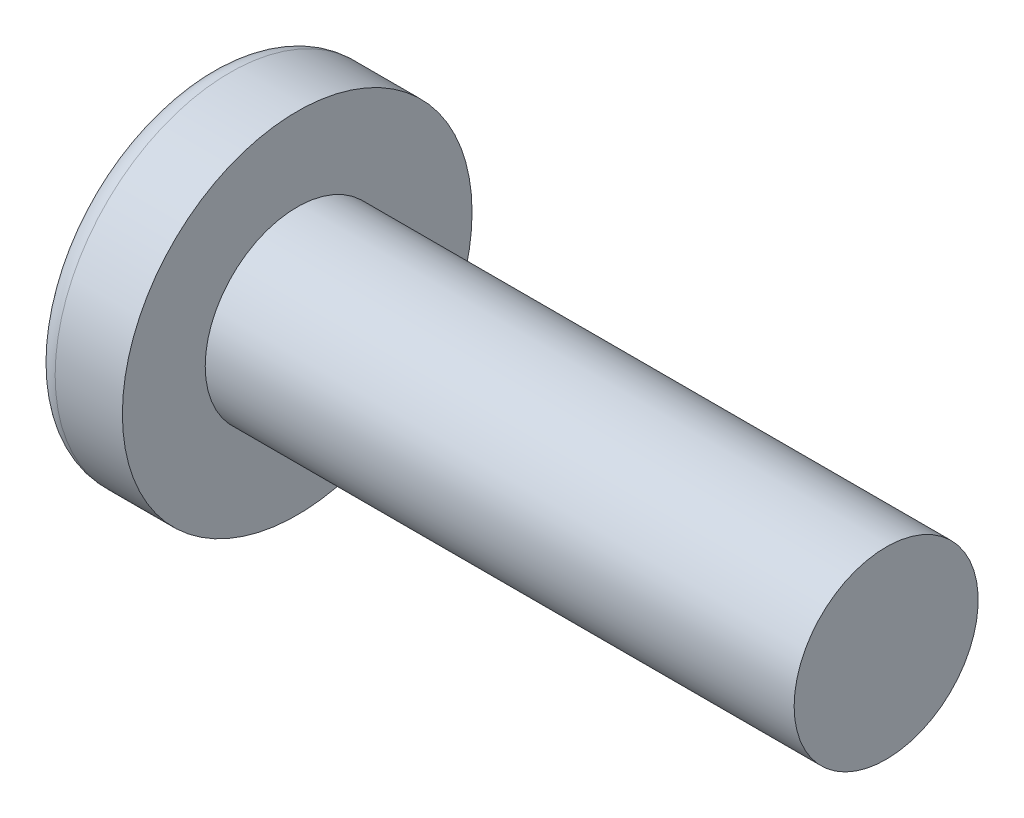
ISO-10303-21;
HEADER;
FILE_DESCRIPTION(('STEP AP214'),'2;1');
FILE_NAME('part.step','',(''),(''),'','','');
FILE_SCHEMA(('AUTOMOTIVE_DESIGN { 1 0 10303 214 1 1 1 1 }'));
ENDSEC;
DATA;
#1=APPLICATION_CONTEXT('core data for automotive mechanical design processes');
#2=APPLICATION_PROTOCOL_DEFINITION('international standard','automotive_design',2000,#1);
#3=PRODUCT_CONTEXT('',#1,'mechanical');
#4=PRODUCT('Part','Part','',(#3));
#5=PRODUCT_RELATED_PRODUCT_CATEGORY('part','',(#4));
#6=PRODUCT_DEFINITION_FORMATION('','',#4);
#7=PRODUCT_DEFINITION_CONTEXT('part definition',#1,'design');
#8=PRODUCT_DEFINITION('design','',#6,#7);
#9=PRODUCT_DEFINITION_SHAPE('','',#8);
#10=(LENGTH_UNIT() NAMED_UNIT(*) SI_UNIT(.MILLI.,.METRE.));
#11=(NAMED_UNIT(*) PLANE_ANGLE_UNIT() SI_UNIT($,.RADIAN.));
#12=(NAMED_UNIT(*) SI_UNIT($,.STERADIAN.) SOLID_ANGLE_UNIT());
#13=UNCERTAINTY_MEASURE_WITH_UNIT(LENGTH_MEASURE(1.E-05),#10,'distance_accuracy_value','');
#14=(GEOMETRIC_REPRESENTATION_CONTEXT(3) GLOBAL_UNCERTAINTY_ASSIGNED_CONTEXT((#13)) GLOBAL_UNIT_ASSIGNED_CONTEXT((#10,
#11,#12)) REPRESENTATION_CONTEXT('',''));
#15=CARTESIAN_POINT('',(0.,0.,0.));
#16=DIRECTION('',(0.,0.,1.));
#17=DIRECTION('',(1.,0.,0.));
#18=AXIS2_PLACEMENT_3D('',#15,#16,#17);
#19=CARTESIAN_POINT('',(-12.2791848078941,5.36412812236495,7.05673995589386));
#20=DIRECTION('',(-1.,0.,0.));
#21=DIRECTION('',(0.,1.,0.));
#22=AXIS2_PLACEMENT_3D('',#19,#20,#21);
#23=SPHERICAL_SURFACE('',#22,8.);
#24=CARTESIAN_POINT('',(-18.902736650114,5.36412812236495,7.05673995589386));
#25=DIRECTION('',(-1.,0.,0.));
#26=DIRECTION('',(0.,0.,1.));
#27=AXIS2_PLACEMENT_3D('',#24,#25,#26);
#28=CIRCLE('',#27,4.48648648648649);
#29=CARTESIAN_POINT('',(-18.902736650114,5.36412812236495,11.5432264423804));
#30=VERTEX_POINT('',#29);
#31=EDGE_CURVE('E161',#30,#30,#28,.T.);
#32=ORIENTED_EDGE('',*,*,#31,.T.);
#33=EDGE_LOOP('',(#32));
#34=FACE_BOUND('',#33,.T.);
#35=CARTESIAN_POINT('',(-12.2941591376146,5.18743103166329,7.05673995589386));
#36=DIRECTION('',(-0.0844430766861806,-0.996428304896931,0.));
#37=DIRECTION('',(0.996428304896931,-0.0844430766861806,0.));
#38=AXIS2_PLACEMENT_3D('',#35,#36,#37);
#39=CIRCLE('',#38,7.99803437774476);
#40=CARTESIAN_POINT('',(-19.9540534851163,5.83657462043462,9.26426913890705));
#41=VERTEX_POINT('',#40);
#42=CARTESIAN_POINT('',(-20.2482021568977,5.86150247397542,7.55411430750434));
#43=VERTEX_POINT('',#42);
#44=EDGE_CURVE('E192',#41,#43,#39,.T.);
#45=ORIENTED_EDGE('',*,*,#44,.F.);
#46=CARTESIAN_POINT('',(-13.9642134215179,5.36412812236496,4.7972697694438));
#47=DIRECTION('',(0.597823879730417,0.,0.801627475093059));
#48=DIRECTION('',(0.801627475093059,0.,-0.597823879730417));
#49=AXIS2_PLACEMENT_3D('',#46,#47,#48);
#50=CIRCLE('',#49,7.48702030502205);
#51=CARTESIAN_POINT('',(-19.9540534851163,4.89168162429526,9.26426913890705));
#52=VERTEX_POINT('',#51);
#53=EDGE_CURVE('E157',#41,#52,#50,.T.);
#54=ORIENTED_EDGE('',*,*,#53,.T.);
#55=CARTESIAN_POINT('',(-12.2941591376146,5.5408252130666,7.05673995589386));
#56=DIRECTION('',(-0.0844430766861806,0.996428304896931,0.));
#57=DIRECTION('',(-0.996428304896931,-0.0844430766861806,0.));
#58=AXIS2_PLACEMENT_3D('',#55,#56,#57);
#59=CIRCLE('',#58,7.99803437774476);
#60=CARTESIAN_POINT('',(-20.2482021568977,4.86675377075447,7.55411430750434));
#61=VERTEX_POINT('',#60);
#62=EDGE_CURVE('E113',#61,#52,#59,.T.);
#63=ORIENTED_EDGE('',*,*,#62,.F.);
#64=CARTESIAN_POINT('',(-12.2941591376146,5.36412812236495,6.88004286519221));
#65=DIRECTION('',(-0.0844430766861806,0.,-0.996428304896931));
#66=DIRECTION('',(-0.996428304896931,0.,0.0844430766861806));
#67=AXIS2_PLACEMENT_3D('',#64,#65,#66);
#68=CIRCLE('',#67,7.99803437774476);
#69=CARTESIAN_POINT('',(-19.9540534851163,3.15659893935176,7.52918645396354));
#70=VERTEX_POINT('',#69);
#71=EDGE_CURVE('E138',#70,#61,#68,.T.);
#72=ORIENTED_EDGE('',*,*,#71,.F.);
#73=CARTESIAN_POINT('',(-13.9642134215179,7.62359830881501,7.05673995589386));
#74=DIRECTION('',(0.597823879730417,-0.801627475093059,0.));
#75=DIRECTION('',(0.801627475093059,0.597823879730417,0.));
#76=AXIS2_PLACEMENT_3D('',#73,#74,#75);
#77=CIRCLE('',#76,7.48702030502205);
#78=CARTESIAN_POINT('',(-19.9540534851163,3.15659893935176,6.58429345782418));
#79=VERTEX_POINT('',#78);
#80=EDGE_CURVE('E146',#70,#79,#77,.T.);
#81=ORIENTED_EDGE('',*,*,#80,.T.);
#82=CARTESIAN_POINT('',(-12.2941591376146,5.36412812236495,7.23343704659552));
#83=DIRECTION('',(-0.0844430766861806,0.,0.996428304896931));
#84=DIRECTION('',(0.996428304896931,0.,0.0844430766861806));
#85=AXIS2_PLACEMENT_3D('',#82,#83,#84);
#86=CIRCLE('',#85,7.99803437774476);
#87=CARTESIAN_POINT('',(-20.2482021568977,4.86675377075448,6.55936560428339));
#88=VERTEX_POINT('',#87);
#89=EDGE_CURVE('E56',#88,#79,#86,.T.);
#90=ORIENTED_EDGE('',*,*,#89,.F.);
#91=CARTESIAN_POINT('',(-19.9540534851163,4.89168162429528,4.84921077288068));
#92=VERTEX_POINT('',#91);
#93=EDGE_CURVE('E199',#92,#88,#59,.T.);
#94=ORIENTED_EDGE('',*,*,#93,.F.);
#95=CARTESIAN_POINT('',(-13.9642134215179,5.36412812236494,9.31621014234393));
#96=DIRECTION('',(0.597823879730417,0.,-0.801627475093059));
#97=DIRECTION('',(-0.801627475093059,0.,-0.597823879730417));
#98=AXIS2_PLACEMENT_3D('',#95,#96,#97);
#99=CIRCLE('',#98,7.48702030502205);
#100=CARTESIAN_POINT('',(-19.9540534851163,5.83657462043463,4.84921077288068));
#101=VERTEX_POINT('',#100);
#102=EDGE_CURVE('E139',#92,#101,#99,.T.);
#103=ORIENTED_EDGE('',*,*,#102,.T.);
#104=CARTESIAN_POINT('',(-20.2482021568977,5.86150247397542,6.55936560428339));
#105=VERTEX_POINT('',#104);
#106=EDGE_CURVE('E187',#105,#101,#39,.T.);
#107=ORIENTED_EDGE('',*,*,#106,.F.);
#108=CARTESIAN_POINT('',(-19.9540534851163,7.57165730537813,6.58429345782418));
#109=VERTEX_POINT('',#108);
#110=EDGE_CURVE('E49',#109,#105,#86,.T.);
#111=ORIENTED_EDGE('',*,*,#110,.F.);
#112=CARTESIAN_POINT('',(-13.9642134215179,3.10465793591488,7.05673995589386));
#113=DIRECTION('',(0.597823879730417,0.801627475093059,0.));
#114=DIRECTION('',(-0.801627475093059,0.597823879730417,0.));
#115=AXIS2_PLACEMENT_3D('',#112,#113,#114);
#116=CIRCLE('',#115,7.48702030502205);
#117=CARTESIAN_POINT('',(-19.9540534851163,7.57165730537813,7.52918645396354));
#118=VERTEX_POINT('',#117);
#119=EDGE_CURVE('E11',#109,#118,#116,.T.);
#120=ORIENTED_EDGE('',*,*,#119,.T.);
#121=EDGE_CURVE('E175',#43,#118,#68,.T.);
#122=ORIENTED_EDGE('',*,*,#121,.F.);
#123=EDGE_LOOP('',(#45,#54,#63,#72,#81,#90,#94,#103,#107,#111,#120,#122));
#124=FACE_BOUND('',#123,.T.);
#125=ADVANCED_FACE('F41',(#34,#124),#23,.T.);
#126=CARTESIAN_POINT('',(-16.9939575351668,5.36412812236495,6.83514904680295));
#127=DIRECTION('',(-0.0844430766861806,0.,0.996428304896931));
#128=DIRECTION('',(0.996428304896931,0.,0.0844430766861806));
#129=AXIS2_PLACEMENT_3D('',#126,#127,#128);
#130=PLANE('',#129);
#131=ORIENTED_EDGE('',*,*,#110,.T.);
#132=DIRECTION('',(0.992894609445471,-0.0841436109699554,0.0841436109699551));
#133=VECTOR('',#132,1.);
#134=CARTESIAN_POINT('',(-16.9754445591879,5.58415013518645,6.83671794307236));
#135=LINE('',#134,#133);
#136=CARTESIAN_POINT('',(-17.3291848078941,5.61412812236495,6.80673995589386));
#137=VERTEX_POINT('',#136);
#138=EDGE_CURVE('E181',#105,#137,#135,.T.);
#139=ORIENTED_EDGE('',*,*,#138,.T.);
#140=DIRECTION('',(0.799784057588365,-0.596449127693018,0.0677783099651157));
#141=VECTOR('',#140,1.);
#142=CARTESIAN_POINT('',(-20.2791848078941,7.81412812236495,6.55673995589386));
#143=LINE('',#142,#141);
#144=EDGE_CURVE('E162',#109,#137,#143,.T.);
#145=ORIENTED_EDGE('',*,*,#144,.F.);
#146=EDGE_LOOP('',(#131,#139,#145));
#147=FACE_BOUND('',#146,.T.);
#148=ADVANCED_FACE('F180',(#147),#130,.T.);
#149=DIRECTION('',(0.799784057588365,0.596449127693018,0.0677783099651157));
#150=VECTOR('',#149,1.);
#151=CARTESIAN_POINT('',(-20.2791848078941,2.91412812236495,6.55673995589386));
#152=LINE('',#151,#150);
#153=CARTESIAN_POINT('',(-17.3291848078941,5.11412812236495,6.80673995589386));
#154=VERTEX_POINT('',#153);
#155=EDGE_CURVE('E147',#79,#154,#152,.T.);
#156=ORIENTED_EDGE('',*,*,#155,.T.);
#157=DIRECTION('',(-0.992894609445471,-0.0841436109699548,-0.0841436109699552));
#158=VECTOR('',#157,1.);
#159=CARTESIAN_POINT('',(-16.9754445591879,5.14410610954344,6.83671794307236));
#160=LINE('',#159,#158);
#161=EDGE_CURVE('E202',#154,#88,#160,.T.);
#162=ORIENTED_EDGE('',*,*,#161,.T.);
#163=ORIENTED_EDGE('',*,*,#89,.T.);
#164=EDGE_LOOP('',(#156,#162,#163));
#165=FACE_BOUND('',#164,.T.);
#166=ADVANCED_FACE('F217',(#165),#130,.T.);
#167=CARTESIAN_POINT('',(-16.9939575351668,5.36412812236495,7.27833086498477));
#168=DIRECTION('',(-0.0844430766861806,0.,-0.996428304896931));
#169=DIRECTION('',(-0.996428304896931,0.,0.0844430766861806));
#170=AXIS2_PLACEMENT_3D('',#167,#168,#169);
#171=PLANE('',#170);
#172=DIRECTION('',(0.799784057588365,-0.596449127693018,-0.0677783099651158));
#173=VECTOR('',#172,1.);
#174=CARTESIAN_POINT('',(-20.2791848078941,7.81412812236495,7.55673995589386));
#175=LINE('',#174,#173);
#176=CARTESIAN_POINT('',(-17.3291848078941,5.61412812236495,7.30673995589386));
#177=VERTEX_POINT('',#176);
#178=EDGE_CURVE('E218',#118,#177,#175,.T.);
#179=ORIENTED_EDGE('',*,*,#178,.T.);
#180=DIRECTION('',(-0.992894609445471,0.0841436109699549,0.0841436109699551));
#181=VECTOR('',#180,1.);
#182=CARTESIAN_POINT('',(-16.9754445591879,5.58415013518645,7.27676196871537));
#183=LINE('',#182,#181);
#184=EDGE_CURVE('E196',#177,#43,#183,.T.);
#185=ORIENTED_EDGE('',*,*,#184,.T.);
#186=ORIENTED_EDGE('',*,*,#121,.T.);
#187=EDGE_LOOP('',(#179,#185,#186));
#188=FACE_BOUND('',#187,.T.);
#189=ADVANCED_FACE('F222',(#188),#171,.T.);
#190=ORIENTED_EDGE('',*,*,#71,.T.);
#191=DIRECTION('',(0.992894609445471,0.0841436109699554,-0.0841436109699551));
#192=VECTOR('',#191,1.);
#193=CARTESIAN_POINT('',(-16.9754445591879,5.14410610954344,7.27676196871537));
#194=LINE('',#193,#192);
#195=CARTESIAN_POINT('',(-17.3291848078941,5.11412812236495,7.30673995589386));
#196=VERTEX_POINT('',#195);
#197=EDGE_CURVE('E111',#61,#196,#194,.T.);
#198=ORIENTED_EDGE('',*,*,#197,.T.);
#199=DIRECTION('',(0.799784057588366,0.596449127693018,-0.0677783099651156));
#200=VECTOR('',#199,1.);
#201=CARTESIAN_POINT('',(-20.2791848078941,2.91412812236495,7.55673995589386));
#202=LINE('',#201,#200);
#203=EDGE_CURVE('E136',#70,#196,#202,.T.);
#204=ORIENTED_EDGE('',*,*,#203,.F.);
#205=EDGE_LOOP('',(#190,#198,#204));
#206=FACE_BOUND('',#205,.T.);
#207=ADVANCED_FACE('F135',(#206),#171,.T.);
#208=CARTESIAN_POINT('',(-45.6791848078941,5.36412812236495,7.05673995589386));
#209=DIRECTION('',(-1.,0.,0.));
#210=DIRECTION('',(0.,0.,1.));
#211=AXIS2_PLACEMENT_3D('',#208,#209,#210);
#212=CYLINDRICAL_SURFACE('',#211,2.5);
#213=CARTESIAN_POINT('',(-0.579184807894116,5.36412812236495,7.05673995589386));
#214=DIRECTION('',(-1.,0.,0.));
#215=DIRECTION('',(0.,0.,1.));
#216=AXIS2_PLACEMENT_3D('',#213,#214,#215);
#217=CIRCLE('',#216,2.5);
#218=CARTESIAN_POINT('',(-0.579184807894116,5.36412812236495,9.55673995589386));
#219=VERTEX_POINT('',#218);
#220=EDGE_CURVE('E158',#219,#219,#217,.T.);
#221=ORIENTED_EDGE('',*,*,#220,.T.);
#222=EDGE_LOOP('',(#221));
#223=FACE_BOUND('',#222,.T.);
#224=CARTESIAN_POINT('',(-16.5791848078941,5.36412812236495,7.05673995589386));
#225=DIRECTION('',(-1.,0.,0.));
#226=DIRECTION('',(0.,0.,1.));
#227=AXIS2_PLACEMENT_3D('',#224,#225,#226);
#228=CIRCLE('',#227,2.5);
#229=CARTESIAN_POINT('',(-16.5791848078941,5.36412812236495,9.55673995589386));
#230=VERTEX_POINT('',#229);
#231=EDGE_CURVE('E171',#230,#230,#228,.T.);
#232=ORIENTED_EDGE('',*,*,#231,.F.);
#233=EDGE_LOOP('',(#232));
#234=FACE_BOUND('',#233,.T.);
#235=ADVANCED_FACE('F43',(#223,#234),#212,.T.);
#236=CARTESIAN_POINT('',(-16.5791848078941,7.86412812236495,7.05673995589386));
#237=DIRECTION('',(-1.,0.,0.));
#238=DIRECTION('',(0.,0.,1.));
#239=AXIS2_PLACEMENT_3D('',#236,#237,#238);
#240=PLANE('',#239);
#241=CARTESIAN_POINT('',(-16.5791848078941,5.36412812236495,7.05673995589386));
#242=DIRECTION('',(-1.,0.,0.));
#243=DIRECTION('',(0.,0.,1.));
#244=AXIS2_PLACEMENT_3D('',#241,#242,#243);
#245=CIRCLE('',#244,4.75);
#246=CARTESIAN_POINT('',(-16.5791848078941,5.36412812236495,11.8067399558939));
#247=VERTEX_POINT('',#246);
#248=EDGE_CURVE('E168',#247,#247,#245,.T.);
#249=ORIENTED_EDGE('',*,*,#248,.F.);
#250=EDGE_LOOP('',(#249));
#251=FACE_BOUND('',#250,.T.);
#252=ORIENTED_EDGE('',*,*,#231,.T.);
#253=EDGE_LOOP('',(#252));
#254=FACE_BOUND('',#253,.T.);
#255=ADVANCED_FACE('F250',(#251,#254),#240,.F.);
#256=CARTESIAN_POINT('',(-45.6791848078941,5.36412812236495,7.05673995589386));
#257=DIRECTION('',(-1.,0.,0.));
#258=DIRECTION('',(0.,0.,1.));
#259=AXIS2_PLACEMENT_3D('',#256,#257,#258);
#260=CYLINDRICAL_SURFACE('',#259,4.75);
#261=ORIENTED_EDGE('',*,*,#248,.T.);
#262=EDGE_LOOP('',(#261));
#263=FACE_BOUND('',#262,.T.);
#264=CARTESIAN_POINT('',(-18.4059702619475,5.36412812236495,7.05673995589386));
#265=DIRECTION('',(-1.,0.,0.));
#266=DIRECTION('',(0.,0.,1.));
#267=AXIS2_PLACEMENT_3D('',#264,#265,#266);
#268=CIRCLE('',#267,4.75);
#269=CARTESIAN_POINT('',(-18.4059702619475,5.36412812236495,11.8067399558939));
#270=VERTEX_POINT('',#269);
#271=EDGE_CURVE('E165',#270,#270,#268,.T.);
#272=ORIENTED_EDGE('',*,*,#271,.F.);
#273=EDGE_LOOP('',(#272));
#274=FACE_BOUND('',#273,.T.);
#275=ADVANCED_FACE('F247',(#263,#274),#260,.T.);
#276=CARTESIAN_POINT('',(-18.4059702619475,5.36412812236495,7.05673995589386));
#277=DIRECTION('',(-1.,0.,0.));
#278=DIRECTION('',(0.,0.,1.));
#279=AXIS2_PLACEMENT_3D('',#276,#277,#278);
#280=TOROIDAL_SURFACE('',#279,4.15,0.599999999999999);
#281=ORIENTED_EDGE('',*,*,#271,.T.);
#282=EDGE_LOOP('',(#281));
#283=FACE_BOUND('',#282,.T.);
#284=ORIENTED_EDGE('',*,*,#31,.F.);
#285=EDGE_LOOP('',(#284));
#286=FACE_BOUND('',#285,.T.);
#287=ADVANCED_FACE('F244',(#283,#286),#280,.T.);
#288=CARTESIAN_POINT('',(-0.579184807894116,7.86412812236495,7.05673995589386));
#289=DIRECTION('',(1.,0.,0.));
#290=DIRECTION('',(0.,0.,-1.));
#291=AXIS2_PLACEMENT_3D('',#288,#289,#290);
#292=PLANE('',#291);
#293=ORIENTED_EDGE('',*,*,#220,.F.);
#294=EDGE_LOOP('',(#293));
#295=FACE_BOUND('',#294,.T.);
#296=ADVANCED_FACE('F242',(#295),#292,.T.);
#297=CARTESIAN_POINT('',(-17.3291848078941,5.61412812236495,7.30673995589386));
#298=DIRECTION('',(0.597823879730417,0.801627475093059,0.));
#299=DIRECTION('',(-0.801627475093059,0.597823879730417,0.));
#300=AXIS2_PLACEMENT_3D('',#297,#298,#299);
#301=PLANE('',#300);
#302=ORIENTED_EDGE('',*,*,#144,.T.);
#303=DIRECTION('',(0.,0.,-1.));
#304=VECTOR('',#303,1.);
#305=CARTESIAN_POINT('',(-17.3291848078941,5.61412812236495,7.30673995589386));
#306=LINE('',#305,#304);
#307=EDGE_CURVE('E129',#177,#137,#306,.T.);
#308=ORIENTED_EDGE('',*,*,#307,.F.);
#309=ORIENTED_EDGE('',*,*,#178,.F.);
#310=ORIENTED_EDGE('',*,*,#119,.F.);
#311=EDGE_LOOP('',(#302,#308,#309,#310));
#312=FACE_BOUND('',#311,.T.);
#313=ADVANCED_FACE('F221',(#312),#301,.F.);
#314=CARTESIAN_POINT('',(-17.3291848078941,5.11412812236495,6.80673995589386));
#315=DIRECTION('',(0.597823879730417,-0.801627475093059,0.));
#316=DIRECTION('',(0.801627475093059,0.597823879730417,0.));
#317=AXIS2_PLACEMENT_3D('',#314,#315,#316);
#318=PLANE('',#317);
#319=ORIENTED_EDGE('',*,*,#203,.T.);
#320=DIRECTION('',(0.,0.,1.));
#321=VECTOR('',#320,1.);
#322=CARTESIAN_POINT('',(-17.3291848078941,5.11412812236495,6.80673995589386));
#323=LINE('',#322,#321);
#324=EDGE_CURVE('E128',#154,#196,#323,.T.);
#325=ORIENTED_EDGE('',*,*,#324,.F.);
#326=ORIENTED_EDGE('',*,*,#155,.F.);
#327=ORIENTED_EDGE('',*,*,#80,.F.);
#328=EDGE_LOOP('',(#319,#325,#326,#327));
#329=FACE_BOUND('',#328,.T.);
#330=ADVANCED_FACE('F143',(#329),#318,.F.);
#331=CARTESIAN_POINT('',(-17.3291848078941,5.61412812236495,6.80673995589386));
#332=DIRECTION('',(-1.,0.,0.));
#333=DIRECTION('',(0.,0.,1.));
#334=AXIS2_PLACEMENT_3D('',#331,#332,#333);
#335=PLANE('',#334);
#336=DIRECTION('',(0.,1.,0.));
#337=VECTOR('',#336,1.);
#338=CARTESIAN_POINT('',(-17.3291848078941,5.11412812236495,6.80673995589386));
#339=LINE('',#338,#337);
#340=EDGE_CURVE('E151',#154,#137,#339,.T.);
#341=ORIENTED_EDGE('',*,*,#340,.F.);
#342=ORIENTED_EDGE('',*,*,#324,.T.);
#343=DIRECTION('',(0.,-1.,0.));
#344=VECTOR('',#343,1.);
#345=CARTESIAN_POINT('',(-17.3291848078941,5.61412812236495,7.30673995589386));
#346=LINE('',#345,#344);
#347=EDGE_CURVE('E120',#177,#196,#346,.T.);
#348=ORIENTED_EDGE('',*,*,#347,.F.);
#349=ORIENTED_EDGE('',*,*,#307,.T.);
#350=EDGE_LOOP('',(#341,#342,#348,#349));
#351=FACE_BOUND('',#350,.T.);
#352=ADVANCED_FACE('F149',(#351),#335,.T.);
#353=CARTESIAN_POINT('',(-17.3291848078941,5.61412812236495,6.80673995589386));
#354=DIRECTION('',(0.597823879730417,0.,-0.801627475093059));
#355=DIRECTION('',(0.801627475093059,0.,0.597823879730417));
#356=AXIS2_PLACEMENT_3D('',#353,#354,#355);
#357=PLANE('',#356);
#358=DIRECTION('',(0.799784057588366,0.0677783099651135,0.596449127693019));
#359=VECTOR('',#358,1.);
#360=CARTESIAN_POINT('',(-20.2791848078941,4.86412812236496,4.60673995589386));
#361=LINE('',#360,#359);
#362=EDGE_CURVE('E207',#92,#154,#361,.T.);
#363=ORIENTED_EDGE('',*,*,#362,.T.);
#364=ORIENTED_EDGE('',*,*,#340,.T.);
#365=DIRECTION('',(0.799784057588365,-0.0677783099651178,0.596449127693018));
#366=VECTOR('',#365,1.);
#367=CARTESIAN_POINT('',(-20.2791848078941,5.86412812236496,4.60673995589386));
#368=LINE('',#367,#366);
#369=EDGE_CURVE('E117',#101,#137,#368,.T.);
#370=ORIENTED_EDGE('',*,*,#369,.F.);
#371=ORIENTED_EDGE('',*,*,#102,.F.);
#372=EDGE_LOOP('',(#363,#364,#370,#371));
#373=FACE_BOUND('',#372,.T.);
#374=ADVANCED_FACE('F212',(#373),#357,.F.);
#375=CARTESIAN_POINT('',(-16.9939575351668,5.14253721327404,7.05673995589386));
#376=DIRECTION('',(-0.0844430766861806,0.996428304896931,0.));
#377=DIRECTION('',(-0.996428304896931,-0.0844430766861806,0.));
#378=AXIS2_PLACEMENT_3D('',#375,#376,#377);
#379=PLANE('',#378);
#380=ORIENTED_EDGE('',*,*,#93,.T.);
#381=ORIENTED_EDGE('',*,*,#161,.F.);
#382=ORIENTED_EDGE('',*,*,#362,.F.);
#383=EDGE_LOOP('',(#380,#381,#382));
#384=FACE_BOUND('',#383,.T.);
#385=ADVANCED_FACE('F216',(#384),#379,.T.);
#386=CARTESIAN_POINT('',(-16.9939575351668,5.58571903145586,7.05673995589386));
#387=DIRECTION('',(-0.0844430766861806,-0.996428304896931,0.));
#388=DIRECTION('',(0.996428304896931,-0.0844430766861806,0.));
#389=AXIS2_PLACEMENT_3D('',#386,#387,#388);
#390=PLANE('',#389);
#391=ORIENTED_EDGE('',*,*,#106,.T.);
#392=ORIENTED_EDGE('',*,*,#369,.T.);
#393=ORIENTED_EDGE('',*,*,#138,.F.);
#394=EDGE_LOOP('',(#391,#392,#393));
#395=FACE_BOUND('',#394,.T.);
#396=ADVANCED_FACE('F210',(#395),#390,.T.);
#397=CARTESIAN_POINT('',(-17.3291848078941,5.11412812236495,7.30673995589386));
#398=DIRECTION('',(0.597823879730417,0.,0.801627475093059));
#399=DIRECTION('',(-0.801627475093059,0.,0.597823879730417));
#400=AXIS2_PLACEMENT_3D('',#397,#398,#399);
#401=PLANE('',#400);
#402=DIRECTION('',(0.799784057588365,-0.0677783099651136,-0.596449127693019));
#403=VECTOR('',#402,1.);
#404=CARTESIAN_POINT('',(-20.2791848078941,5.86412812236494,9.50673995589387));
#405=LINE('',#404,#403);
#406=EDGE_CURVE('E116',#41,#177,#405,.T.);
#407=ORIENTED_EDGE('',*,*,#406,.T.);
#408=ORIENTED_EDGE('',*,*,#347,.T.);
#409=DIRECTION('',(0.799784057588365,0.0677783099651179,-0.596449127693018));
#410=VECTOR('',#409,1.);
#411=CARTESIAN_POINT('',(-20.2791848078941,4.86412812236494,9.50673995589386));
#412=LINE('',#411,#410);
#413=EDGE_CURVE('E107',#52,#196,#412,.T.);
#414=ORIENTED_EDGE('',*,*,#413,.F.);
#415=ORIENTED_EDGE('',*,*,#53,.F.);
#416=EDGE_LOOP('',(#407,#408,#414,#415));
#417=FACE_BOUND('',#416,.T.);
#418=ADVANCED_FACE('F121',(#417),#401,.F.);
#419=ORIENTED_EDGE('',*,*,#44,.T.);
#420=ORIENTED_EDGE('',*,*,#184,.F.);
#421=ORIENTED_EDGE('',*,*,#406,.F.);
#422=EDGE_LOOP('',(#419,#420,#421));
#423=FACE_BOUND('',#422,.T.);
#424=ADVANCED_FACE('F223',(#423),#390,.T.);
#425=ORIENTED_EDGE('',*,*,#62,.T.);
#426=ORIENTED_EDGE('',*,*,#413,.T.);
#427=ORIENTED_EDGE('',*,*,#197,.F.);
#428=EDGE_LOOP('',(#425,#426,#427));
#429=FACE_BOUND('',#428,.T.);
#430=ADVANCED_FACE('F109',(#429),#379,.T.);
#431=CLOSED_SHELL('',(#125,#148,#166,#189,#207,#235,#255,#275,#287,#296,#313,#330,#352,#374,
#385,#396,#418,#424,#430));
#432=MANIFOLD_SOLID_BREP('B2',#431);
#433=ADVANCED_BREP_SHAPE_REPRESENTATION('',(#18,#432),#14);
#434=SHAPE_DEFINITION_REPRESENTATION(#9,#433);
ENDSEC;
END-ISO-10303-21;
